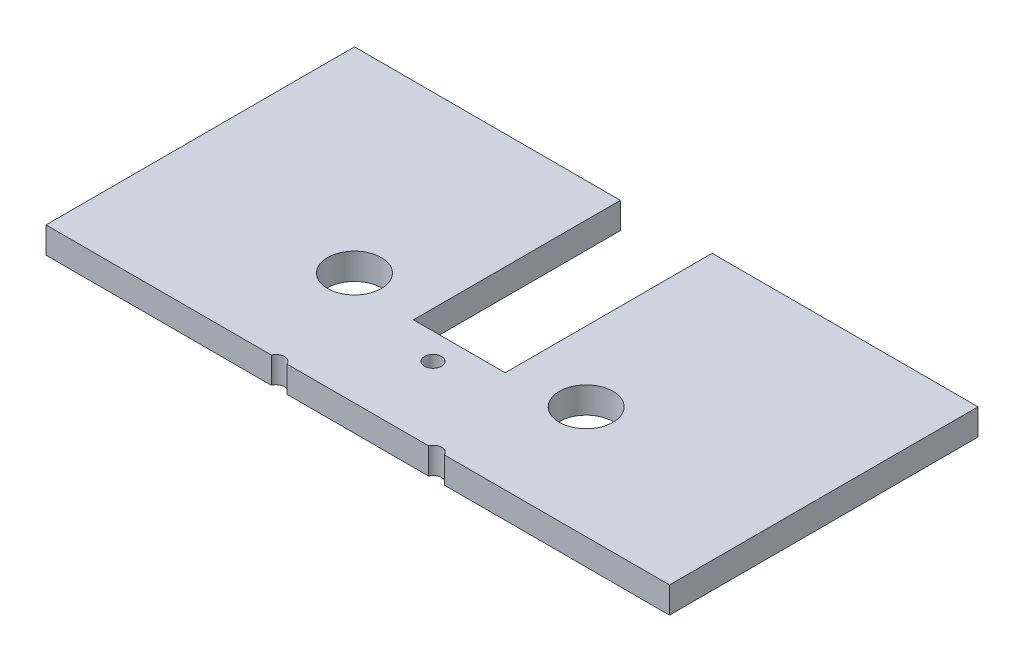
ISO-10303-21;
HEADER;
FILE_DESCRIPTION(('STEP AP214'),'2;1');
FILE_NAME('part.step','',(''),(''),'','','');
FILE_SCHEMA(('AUTOMOTIVE_DESIGN { 1 0 10303 214 1 1 1 1 }'));
ENDSEC;
DATA;
#1=APPLICATION_CONTEXT('core data for automotive mechanical design processes');
#2=APPLICATION_PROTOCOL_DEFINITION('international standard','automotive_design',2000,#1);
#3=PRODUCT_CONTEXT('',#1,'mechanical');
#4=PRODUCT('Part','Part','',(#3));
#5=PRODUCT_RELATED_PRODUCT_CATEGORY('part','',(#4));
#6=PRODUCT_DEFINITION_FORMATION('','',#4);
#7=PRODUCT_DEFINITION_CONTEXT('part definition',#1,'design');
#8=PRODUCT_DEFINITION('design','',#6,#7);
#9=PRODUCT_DEFINITION_SHAPE('','',#8);
#10=(LENGTH_UNIT() NAMED_UNIT(*) SI_UNIT(.MILLI.,.METRE.));
#11=(NAMED_UNIT(*) PLANE_ANGLE_UNIT() SI_UNIT($,.RADIAN.));
#12=(NAMED_UNIT(*) SI_UNIT($,.STERADIAN.) SOLID_ANGLE_UNIT());
#13=UNCERTAINTY_MEASURE_WITH_UNIT(LENGTH_MEASURE(1.E-05),#10,'distance_accuracy_value','');
#14=(GEOMETRIC_REPRESENTATION_CONTEXT(3) GLOBAL_UNCERTAINTY_ASSIGNED_CONTEXT((#13)) GLOBAL_UNIT_ASSIGNED_CONTEXT((#10,
#11,#12)) REPRESENTATION_CONTEXT('',''));
#15=CARTESIAN_POINT('',(0.,0.,0.));
#16=DIRECTION('',(0.,0.,1.));
#17=DIRECTION('',(1.,0.,0.));
#18=AXIS2_PLACEMENT_3D('',#15,#16,#17);
#19=CARTESIAN_POINT('',(-13.78858,2.,6.76929));
#20=DIRECTION('',(0.,0.,-1.));
#21=DIRECTION('',(-1.,0.,0.));
#22=AXIS2_PLACEMENT_3D('',#19,#20,#21);
#23=PLANE('',#22);
#24=DIRECTION('',(1.,0.,0.));
#25=VECTOR('',#24,1.);
#26=CARTESIAN_POINT('',(-13.78858,0.,6.76929));
#27=LINE('',#26,#25);
#28=CARTESIAN_POINT('',(-5.4,0.,6.76929));
#29=VERTEX_POINT('',#28);
#30=CARTESIAN_POINT('',(5.4,0.,6.76929));
#31=VERTEX_POINT('',#30);
#32=EDGE_CURVE('E142',#29,#31,#27,.T.);
#33=ORIENTED_EDGE('',*,*,#32,.T.);
#34=DIRECTION('',(0.,1.,0.));
#35=VECTOR('',#34,1.);
#36=CARTESIAN_POINT('',(5.4,0.,6.76929));
#37=LINE('',#36,#35);
#38=CARTESIAN_POINT('',(5.4,2.,6.76929));
#39=VERTEX_POINT('',#38);
#40=EDGE_CURVE('E11',#31,#39,#37,.T.);
#41=ORIENTED_EDGE('',*,*,#40,.T.);
#42=DIRECTION('',(1.,0.,0.));
#43=VECTOR('',#42,1.);
#44=CARTESIAN_POINT('',(-13.78858,2.,6.76929));
#45=LINE('',#44,#43);
#46=CARTESIAN_POINT('',(-5.4,2.,6.76929));
#47=VERTEX_POINT('',#46);
#48=EDGE_CURVE('E253',#47,#39,#45,.T.);
#49=ORIENTED_EDGE('',*,*,#48,.F.);
#50=DIRECTION('',(0.,1.,0.));
#51=VECTOR('',#50,1.);
#52=CARTESIAN_POINT('',(-5.4,0.,6.76929));
#53=LINE('',#52,#51);
#54=EDGE_CURVE('E270',#47,#29,#53,.F.);
#55=ORIENTED_EDGE('',*,*,#54,.T.);
#56=EDGE_LOOP('',(#33,#41,#49,#55));
#57=FACE_BOUND('',#56,.T.);
#58=ADVANCED_FACE('F43',(#57),#23,.F.);
#59=CARTESIAN_POINT('',(-23.78858,0.,6.76929));
#60=VERTEX_POINT('',#59);
#61=CARTESIAN_POINT('',(-6.6,0.,6.76929));
#62=VERTEX_POINT('',#61);
#63=EDGE_CURVE('E145',#60,#62,#27,.T.);
#64=ORIENTED_EDGE('',*,*,#63,.T.);
#65=DIRECTION('',(0.,1.,0.));
#66=VECTOR('',#65,1.);
#67=CARTESIAN_POINT('',(-6.6,0.,6.76929));
#68=LINE('',#67,#66);
#69=CARTESIAN_POINT('',(-6.6,2.,6.76929));
#70=VERTEX_POINT('',#69);
#71=EDGE_CURVE('E273',#62,#70,#68,.T.);
#72=ORIENTED_EDGE('',*,*,#71,.T.);
#73=CARTESIAN_POINT('',(-23.78858,2.,6.76929));
#74=VERTEX_POINT('',#73);
#75=EDGE_CURVE('E248',#74,#70,#45,.T.);
#76=ORIENTED_EDGE('',*,*,#75,.F.);
#77=DIRECTION('',(0.,1.,0.));
#78=VECTOR('',#77,1.);
#79=CARTESIAN_POINT('',(-23.78858,-31.0755728319334,6.76929));
#80=LINE('',#79,#78);
#81=EDGE_CURVE('E183',#60,#74,#80,.T.);
#82=ORIENTED_EDGE('',*,*,#81,.F.);
#83=EDGE_LOOP('',(#64,#72,#76,#82));
#84=FACE_BOUND('',#83,.T.);
#85=ADVANCED_FACE('F288',(#84),#23,.F.);
#86=CARTESIAN_POINT('',(0.,2.,0.));
#87=DIRECTION('',(0.,1.,0.));
#88=DIRECTION('',(0.,0.,1.));
#89=AXIS2_PLACEMENT_3D('',#86,#87,#88);
#90=PLANE('',#89);
#91=DIRECTION('',(-1.,0.,0.));
#92=VECTOR('',#91,1.);
#93=CARTESIAN_POINT('',(3.5,2.,-16.76929));
#94=LINE('',#93,#92);
#95=CARTESIAN_POINT('',(23.78858,2.,-16.76929));
#96=VERTEX_POINT('',#95);
#97=CARTESIAN_POINT('',(3.5,2.,-16.76929));
#98=VERTEX_POINT('',#97);
#99=EDGE_CURVE('E161',#96,#98,#94,.T.);
#100=ORIENTED_EDGE('',*,*,#99,.T.);
#101=DIRECTION('',(0.,0.,1.));
#102=VECTOR('',#101,1.);
#103=CARTESIAN_POINT('',(3.5,2.,-0.980710000000001));
#104=LINE('',#103,#102);
#105=CARTESIAN_POINT('',(3.5,2.,-0.980710000000001));
#106=VERTEX_POINT('',#105);
#107=EDGE_CURVE('E238',#98,#106,#104,.T.);
#108=ORIENTED_EDGE('',*,*,#107,.T.);
#109=DIRECTION('',(-1.,0.,0.));
#110=VECTOR('',#109,1.);
#111=CARTESIAN_POINT('',(-3.5,2.,-0.98071));
#112=LINE('',#111,#110);
#113=CARTESIAN_POINT('',(-3.5,2.,-0.98071));
#114=VERTEX_POINT('',#113);
#115=EDGE_CURVE('E241',#106,#114,#112,.T.);
#116=ORIENTED_EDGE('',*,*,#115,.T.);
#117=DIRECTION('',(0.,0.,-1.));
#118=VECTOR('',#117,1.);
#119=CARTESIAN_POINT('',(-3.5,2.,-6.76929));
#120=LINE('',#119,#118);
#121=CARTESIAN_POINT('',(-3.5,2.,-16.76929));
#122=VERTEX_POINT('',#121);
#123=EDGE_CURVE('E244',#114,#122,#120,.T.);
#124=ORIENTED_EDGE('',*,*,#123,.T.);
#125=DIRECTION('',(-1.,0.,0.));
#126=VECTOR('',#125,1.);
#127=CARTESIAN_POINT('',(-23.78858,2.,-16.76929));
#128=LINE('',#127,#126);
#129=CARTESIAN_POINT('',(-23.78858,2.,-16.76929));
#130=VERTEX_POINT('',#129);
#131=EDGE_CURVE('E175',#122,#130,#128,.T.);
#132=ORIENTED_EDGE('',*,*,#131,.T.);
#133=DIRECTION('',(0.,0.,1.));
#134=VECTOR('',#133,1.);
#135=CARTESIAN_POINT('',(-23.78858,2.,6.76929));
#136=LINE('',#135,#134);
#137=EDGE_CURVE('E189',#130,#74,#136,.T.);
#138=ORIENTED_EDGE('',*,*,#137,.T.);
#139=ORIENTED_EDGE('',*,*,#75,.T.);
#140=CARTESIAN_POINT('',(-6.,2.,7.01929));
#141=DIRECTION('',(0.,1.,0.));
#142=DIRECTION('',(0.,0.,1.));
#143=AXIS2_PLACEMENT_3D('',#140,#141,#142);
#144=CIRCLE('',#143,0.65);
#145=EDGE_CURVE('E209',#47,#70,#144,.T.);
#146=ORIENTED_EDGE('',*,*,#145,.F.);
#147=ORIENTED_EDGE('',*,*,#48,.T.);
#148=CARTESIAN_POINT('',(6.,2.,7.01929));
#149=DIRECTION('',(0.,1.,0.));
#150=DIRECTION('',(0.,0.,1.));
#151=AXIS2_PLACEMENT_3D('',#148,#149,#150);
#152=CIRCLE('',#151,0.65);
#153=CARTESIAN_POINT('',(6.6,2.,6.76929));
#154=VERTEX_POINT('',#153);
#155=EDGE_CURVE('E206',#154,#39,#152,.T.);
#156=ORIENTED_EDGE('',*,*,#155,.F.);
#157=CARTESIAN_POINT('',(23.78858,2.,6.76929));
#158=VERTEX_POINT('',#157);
#159=EDGE_CURVE('E247',#154,#158,#45,.T.);
#160=ORIENTED_EDGE('',*,*,#159,.T.);
#161=DIRECTION('',(0.,0.,-1.));
#162=VECTOR('',#161,1.);
#163=CARTESIAN_POINT('',(23.78858,2.,-16.76929));
#164=LINE('',#163,#162);
#165=EDGE_CURVE('E159',#158,#96,#164,.T.);
#166=ORIENTED_EDGE('',*,*,#165,.T.);
#167=EDGE_LOOP('',(#100,#108,#116,#124,#132,#138,#139,#146,#147,#156,#160,#166));
#168=FACE_BOUND('',#167,.T.);
#169=CARTESIAN_POINT('',(-0.00858000000000282,2.,1.01929));
#170=DIRECTION('',(0.,1.,0.));
#171=DIRECTION('',(0.,0.,1.));
#172=AXIS2_PLACEMENT_3D('',#169,#170,#171);
#173=CIRCLE('',#172,0.65);
#174=CARTESIAN_POINT('',(-0.00858000000000282,2.,1.66929));
#175=VERTEX_POINT('',#174);
#176=EDGE_CURVE('E205',#175,#175,#173,.T.);
#177=ORIENTED_EDGE('',*,*,#176,.F.);
#178=EDGE_LOOP('',(#177));
#179=FACE_BOUND('',#178,.T.);
#180=CARTESIAN_POINT('',(-8.84,2.,-1.81955));
#181=DIRECTION('',(0.,1.,0.));
#182=DIRECTION('',(0.,0.,1.));
#183=AXIS2_PLACEMENT_3D('',#180,#181,#182);
#184=CIRCLE('',#183,2.05);
#185=CARTESIAN_POINT('',(-8.84,2.,0.23045));
#186=VERTEX_POINT('',#185);
#187=EDGE_CURVE('E230',#186,#186,#184,.T.);
#188=ORIENTED_EDGE('',*,*,#187,.F.);
#189=EDGE_LOOP('',(#188));
#190=FACE_BOUND('',#189,.T.);
#191=CARTESIAN_POINT('',(8.84,2.,-1.81955));
#192=DIRECTION('',(0.,1.,0.));
#193=DIRECTION('',(0.,0.,1.));
#194=AXIS2_PLACEMENT_3D('',#191,#192,#193);
#195=CIRCLE('',#194,2.05);
#196=CARTESIAN_POINT('',(8.84,2.,0.23045));
#197=VERTEX_POINT('',#196);
#198=EDGE_CURVE('E222',#197,#197,#195,.T.);
#199=ORIENTED_EDGE('',*,*,#198,.F.);
#200=EDGE_LOOP('',(#199));
#201=FACE_BOUND('',#200,.T.);
#202=ADVANCED_FACE('F294',(#168,#179,#190,#201),#90,.T.);
#203=CARTESIAN_POINT('',(0.,0.,0.));
#204=DIRECTION('',(0.,1.,0.));
#205=DIRECTION('',(0.,0.,1.));
#206=AXIS2_PLACEMENT_3D('',#203,#204,#205);
#207=PLANE('',#206);
#208=DIRECTION('',(0.,0.,1.));
#209=VECTOR('',#208,1.);
#210=CARTESIAN_POINT('',(3.5,0.,-0.980710000000001));
#211=LINE('',#210,#209);
#212=CARTESIAN_POINT('',(3.5,0.,-16.76929));
#213=VERTEX_POINT('',#212);
#214=CARTESIAN_POINT('',(3.5,0.,-0.980710000000001));
#215=VERTEX_POINT('',#214);
#216=EDGE_CURVE('E234',#213,#215,#211,.T.);
#217=ORIENTED_EDGE('',*,*,#216,.F.);
#218=DIRECTION('',(1.,0.,0.));
#219=VECTOR('',#218,1.);
#220=CARTESIAN_POINT('',(3.5,0.,-16.76929));
#221=LINE('',#220,#219);
#222=CARTESIAN_POINT('',(23.78858,0.,-16.76929));
#223=VERTEX_POINT('',#222);
#224=EDGE_CURVE('E151',#213,#223,#221,.T.);
#225=ORIENTED_EDGE('',*,*,#224,.T.);
#226=DIRECTION('',(0.,0.,1.));
#227=VECTOR('',#226,1.);
#228=CARTESIAN_POINT('',(23.78858,0.,-16.76929));
#229=LINE('',#228,#227);
#230=CARTESIAN_POINT('',(23.78858,0.,6.76929));
#231=VERTEX_POINT('',#230);
#232=EDGE_CURVE('E147',#223,#231,#229,.T.);
#233=ORIENTED_EDGE('',*,*,#232,.T.);
#234=CARTESIAN_POINT('',(6.6,0.,6.76929));
#235=VERTEX_POINT('',#234);
#236=EDGE_CURVE('E133',#235,#231,#27,.T.);
#237=ORIENTED_EDGE('',*,*,#236,.F.);
#238=CARTESIAN_POINT('',(6.,0.,7.01929));
#239=DIRECTION('',(0.,1.,0.));
#240=DIRECTION('',(0.,0.,1.));
#241=AXIS2_PLACEMENT_3D('',#238,#239,#240);
#242=CIRCLE('',#241,0.65);
#243=EDGE_CURVE('E59',#235,#31,#242,.T.);
#244=ORIENTED_EDGE('',*,*,#243,.T.);
#245=ORIENTED_EDGE('',*,*,#32,.F.);
#246=CARTESIAN_POINT('',(-6.,0.,7.01929));
#247=DIRECTION('',(0.,1.,0.));
#248=DIRECTION('',(0.,0.,1.));
#249=AXIS2_PLACEMENT_3D('',#246,#247,#248);
#250=CIRCLE('',#249,0.65);
#251=EDGE_CURVE('E67',#29,#62,#250,.T.);
#252=ORIENTED_EDGE('',*,*,#251,.T.);
#253=ORIENTED_EDGE('',*,*,#63,.F.);
#254=DIRECTION('',(0.,0.,-1.));
#255=VECTOR('',#254,1.);
#256=CARTESIAN_POINT('',(-23.78858,0.,6.76929));
#257=LINE('',#256,#255);
#258=CARTESIAN_POINT('',(-23.78858,0.,-16.76929));
#259=VERTEX_POINT('',#258);
#260=EDGE_CURVE('E182',#60,#259,#257,.T.);
#261=ORIENTED_EDGE('',*,*,#260,.T.);
#262=DIRECTION('',(1.,0.,0.));
#263=VECTOR('',#262,1.);
#264=CARTESIAN_POINT('',(-23.78858,0.,-16.76929));
#265=LINE('',#264,#263);
#266=CARTESIAN_POINT('',(-3.5,0.,-16.76929));
#267=VERTEX_POINT('',#266);
#268=EDGE_CURVE('E178',#259,#267,#265,.T.);
#269=ORIENTED_EDGE('',*,*,#268,.T.);
#270=DIRECTION('',(0.,0.,-1.));
#271=VECTOR('',#270,1.);
#272=CARTESIAN_POINT('',(-3.5,0.,-6.76929));
#273=LINE('',#272,#271);
#274=CARTESIAN_POINT('',(-3.5,0.,-0.98071));
#275=VERTEX_POINT('',#274);
#276=EDGE_CURVE('E143',#275,#267,#273,.T.);
#277=ORIENTED_EDGE('',*,*,#276,.F.);
#278=DIRECTION('',(-1.,0.,0.));
#279=VECTOR('',#278,1.);
#280=CARTESIAN_POINT('',(-3.5,0.,-0.98071));
#281=LINE('',#280,#279);
#282=EDGE_CURVE('E256',#215,#275,#281,.T.);
#283=ORIENTED_EDGE('',*,*,#282,.F.);
#284=EDGE_LOOP('',(#217,#225,#233,#237,#244,#245,#252,#253,#261,#269,#277,#283));
#285=FACE_BOUND('',#284,.T.);
#286=CARTESIAN_POINT('',(-0.00858000000000282,0.,1.01929));
#287=DIRECTION('',(0.,1.,0.));
#288=DIRECTION('',(0.,0.,1.));
#289=AXIS2_PLACEMENT_3D('',#286,#287,#288);
#290=CIRCLE('',#289,0.65);
#291=CARTESIAN_POINT('',(-0.00858000000000282,0.,1.66929));
#292=VERTEX_POINT('',#291);
#293=EDGE_CURVE('E214',#292,#292,#290,.T.);
#294=ORIENTED_EDGE('',*,*,#293,.T.);
#295=EDGE_LOOP('',(#294));
#296=FACE_BOUND('',#295,.T.);
#297=CARTESIAN_POINT('',(-8.84,0.,-1.81955));
#298=DIRECTION('',(0.,1.,0.));
#299=DIRECTION('',(0.,0.,1.));
#300=AXIS2_PLACEMENT_3D('',#297,#298,#299);
#301=CIRCLE('',#300,2.05);
#302=CARTESIAN_POINT('',(-8.84,0.,0.23045));
#303=VERTEX_POINT('',#302);
#304=EDGE_CURVE('E226',#303,#303,#301,.T.);
#305=ORIENTED_EDGE('',*,*,#304,.T.);
#306=EDGE_LOOP('',(#305));
#307=FACE_BOUND('',#306,.T.);
#308=CARTESIAN_POINT('',(8.84,0.,-1.81955));
#309=DIRECTION('',(0.,1.,0.));
#310=DIRECTION('',(0.,0.,1.));
#311=AXIS2_PLACEMENT_3D('',#308,#309,#310);
#312=CIRCLE('',#311,2.05);
#313=CARTESIAN_POINT('',(8.84,0.,0.23045));
#314=VERTEX_POINT('',#313);
#315=EDGE_CURVE('E218',#314,#314,#312,.T.);
#316=ORIENTED_EDGE('',*,*,#315,.T.);
#317=EDGE_LOOP('',(#316));
#318=FACE_BOUND('',#317,.T.);
#319=ADVANCED_FACE('F148',(#285,#296,#307,#318),#207,.F.);
#320=CARTESIAN_POINT('',(3.5,2.,-0.980710000000001));
#321=DIRECTION('',(1.,0.,0.));
#322=DIRECTION('',(0.,0.,-1.));
#323=AXIS2_PLACEMENT_3D('',#320,#321,#322);
#324=PLANE('',#323);
#325=ORIENTED_EDGE('',*,*,#216,.T.);
#326=DIRECTION('',(0.,-1.,0.));
#327=VECTOR('',#326,1.);
#328=CARTESIAN_POINT('',(3.5,2.,-0.980710000000001));
#329=LINE('',#328,#327);
#330=EDGE_CURVE('E266',#106,#215,#329,.T.);
#331=ORIENTED_EDGE('',*,*,#330,.F.);
#332=ORIENTED_EDGE('',*,*,#107,.F.);
#333=DIRECTION('',(0.,1.,0.));
#334=VECTOR('',#333,1.);
#335=CARTESIAN_POINT('',(3.5,-31.0755728319334,-16.76929));
#336=LINE('',#335,#334);
#337=EDGE_CURVE('E155',#213,#98,#336,.T.);
#338=ORIENTED_EDGE('',*,*,#337,.F.);
#339=EDGE_LOOP('',(#325,#331,#332,#338));
#340=FACE_BOUND('',#339,.T.);
#341=ADVANCED_FACE('F45',(#340),#324,.F.);
#342=CARTESIAN_POINT('',(-3.5,2.,-0.98071));
#343=DIRECTION('',(0.,0.,1.));
#344=DIRECTION('',(1.,0.,0.));
#345=AXIS2_PLACEMENT_3D('',#342,#343,#344);
#346=PLANE('',#345);
#347=ORIENTED_EDGE('',*,*,#282,.T.);
#348=DIRECTION('',(0.,-1.,0.));
#349=VECTOR('',#348,1.);
#350=CARTESIAN_POINT('',(-3.5,2.,-0.98071));
#351=LINE('',#350,#349);
#352=EDGE_CURVE('E252',#114,#275,#351,.T.);
#353=ORIENTED_EDGE('',*,*,#352,.F.);
#354=ORIENTED_EDGE('',*,*,#115,.F.);
#355=ORIENTED_EDGE('',*,*,#330,.T.);
#356=EDGE_LOOP('',(#347,#353,#354,#355));
#357=FACE_BOUND('',#356,.T.);
#358=ADVANCED_FACE('F310',(#357),#346,.F.);
#359=CARTESIAN_POINT('',(-3.5,2.,-6.76929));
#360=DIRECTION('',(-1.,0.,0.));
#361=DIRECTION('',(0.,0.,1.));
#362=AXIS2_PLACEMENT_3D('',#359,#360,#361);
#363=PLANE('',#362);
#364=ORIENTED_EDGE('',*,*,#276,.T.);
#365=DIRECTION('',(0.,1.,0.));
#366=VECTOR('',#365,1.);
#367=CARTESIAN_POINT('',(-3.5,-31.0755728319334,-16.76929));
#368=LINE('',#367,#366);
#369=EDGE_CURVE('E193',#267,#122,#368,.T.);
#370=ORIENTED_EDGE('',*,*,#369,.T.);
#371=ORIENTED_EDGE('',*,*,#123,.F.);
#372=ORIENTED_EDGE('',*,*,#352,.T.);
#373=EDGE_LOOP('',(#364,#370,#371,#372));
#374=FACE_BOUND('',#373,.T.);
#375=ADVANCED_FACE('F306',(#374),#363,.F.);
#376=ORIENTED_EDGE('',*,*,#159,.F.);
#377=DIRECTION('',(0.,1.,0.));
#378=VECTOR('',#377,1.);
#379=CARTESIAN_POINT('',(6.6,0.,6.76929));
#380=LINE('',#379,#378);
#381=EDGE_CURVE('E52',#154,#235,#380,.F.);
#382=ORIENTED_EDGE('',*,*,#381,.T.);
#383=ORIENTED_EDGE('',*,*,#236,.T.);
#384=DIRECTION('',(0.,1.,0.));
#385=VECTOR('',#384,1.);
#386=CARTESIAN_POINT('',(23.78858,-31.0755728319334,6.76929));
#387=LINE('',#386,#385);
#388=EDGE_CURVE('E138',#231,#158,#387,.T.);
#389=ORIENTED_EDGE('',*,*,#388,.T.);
#390=EDGE_LOOP('',(#376,#382,#383,#389));
#391=FACE_BOUND('',#390,.T.);
#392=ADVANCED_FACE('F136',(#391),#23,.F.);
#393=CARTESIAN_POINT('',(-8.84,2.,-1.81955));
#394=DIRECTION('',(0.,-1.,0.));
#395=DIRECTION('',(0.,0.,-1.));
#396=AXIS2_PLACEMENT_3D('',#393,#394,#395);
#397=CYLINDRICAL_SURFACE('',#396,2.05);
#398=ORIENTED_EDGE('',*,*,#187,.T.);
#399=EDGE_LOOP('',(#398));
#400=FACE_BOUND('',#399,.T.);
#401=ORIENTED_EDGE('',*,*,#304,.F.);
#402=EDGE_LOOP('',(#401));
#403=FACE_BOUND('',#402,.T.);
#404=ADVANCED_FACE('F339',(#400,#403),#397,.F.);
#405=CARTESIAN_POINT('',(8.84,2.,-1.81955));
#406=DIRECTION('',(0.,-1.,0.));
#407=DIRECTION('',(0.,0.,-1.));
#408=AXIS2_PLACEMENT_3D('',#405,#406,#407);
#409=CYLINDRICAL_SURFACE('',#408,2.05);
#410=ORIENTED_EDGE('',*,*,#198,.T.);
#411=EDGE_LOOP('',(#410));
#412=FACE_BOUND('',#411,.T.);
#413=ORIENTED_EDGE('',*,*,#315,.F.);
#414=EDGE_LOOP('',(#413));
#415=FACE_BOUND('',#414,.T.);
#416=ADVANCED_FACE('F344',(#412,#415),#409,.F.);
#417=CARTESIAN_POINT('',(-0.00858000000000282,0.,1.01929));
#418=DIRECTION('',(0.,1.,0.));
#419=DIRECTION('',(0.,0.,1.));
#420=AXIS2_PLACEMENT_3D('',#417,#418,#419);
#421=CYLINDRICAL_SURFACE('',#420,0.65);
#422=ORIENTED_EDGE('',*,*,#293,.F.);
#423=EDGE_LOOP('',(#422));
#424=FACE_BOUND('',#423,.T.);
#425=ORIENTED_EDGE('',*,*,#176,.T.);
#426=EDGE_LOOP('',(#425));
#427=FACE_BOUND('',#426,.T.);
#428=ADVANCED_FACE('F328',(#424,#427),#421,.F.);
#429=CARTESIAN_POINT('',(-6.,0.,7.01929));
#430=DIRECTION('',(0.,1.,0.));
#431=DIRECTION('',(0.,0.,1.));
#432=AXIS2_PLACEMENT_3D('',#429,#430,#431);
#433=CYLINDRICAL_SURFACE('',#432,0.65);
#434=ORIENTED_EDGE('',*,*,#251,.F.);
#435=ORIENTED_EDGE('',*,*,#54,.F.);
#436=ORIENTED_EDGE('',*,*,#145,.T.);
#437=ORIENTED_EDGE('',*,*,#71,.F.);
#438=EDGE_LOOP('',(#434,#435,#436,#437));
#439=FACE_BOUND('',#438,.T.);
#440=ADVANCED_FACE('F320',(#439),#433,.F.);
#441=CARTESIAN_POINT('',(6.,0.,7.01929));
#442=DIRECTION('',(0.,1.,0.));
#443=DIRECTION('',(0.,0.,1.));
#444=AXIS2_PLACEMENT_3D('',#441,#442,#443);
#445=CYLINDRICAL_SURFACE('',#444,0.65);
#446=ORIENTED_EDGE('',*,*,#243,.F.);
#447=ORIENTED_EDGE('',*,*,#381,.F.);
#448=ORIENTED_EDGE('',*,*,#155,.T.);
#449=ORIENTED_EDGE('',*,*,#40,.F.);
#450=EDGE_LOOP('',(#446,#447,#448,#449));
#451=FACE_BOUND('',#450,.T.);
#452=ADVANCED_FACE('F318',(#451),#445,.F.);
#453=CARTESIAN_POINT('',(-23.78858,-31.0755728319334,6.76929));
#454=DIRECTION('',(-1.,0.,0.));
#455=DIRECTION('',(0.,0.,1.));
#456=AXIS2_PLACEMENT_3D('',#453,#454,#455);
#457=PLANE('',#456);
#458=ORIENTED_EDGE('',*,*,#260,.F.);
#459=ORIENTED_EDGE('',*,*,#81,.T.);
#460=ORIENTED_EDGE('',*,*,#137,.F.);
#461=DIRECTION('',(0.,1.,0.));
#462=VECTOR('',#461,1.);
#463=CARTESIAN_POINT('',(-23.78858,-31.0755728319334,-16.76929));
#464=LINE('',#463,#462);
#465=EDGE_CURVE('E197',#259,#130,#464,.T.);
#466=ORIENTED_EDGE('',*,*,#465,.F.);
#467=EDGE_LOOP('',(#458,#459,#460,#466));
#468=FACE_BOUND('',#467,.T.);
#469=ADVANCED_FACE('F291',(#468),#457,.T.);
#470=CARTESIAN_POINT('',(-23.78858,-31.0755728319334,-16.76929));
#471=DIRECTION('',(0.,0.,-1.));
#472=DIRECTION('',(-1.,0.,0.));
#473=AXIS2_PLACEMENT_3D('',#470,#471,#472);
#474=PLANE('',#473);
#475=ORIENTED_EDGE('',*,*,#268,.F.);
#476=ORIENTED_EDGE('',*,*,#465,.T.);
#477=ORIENTED_EDGE('',*,*,#131,.F.);
#478=ORIENTED_EDGE('',*,*,#369,.F.);
#479=EDGE_LOOP('',(#475,#476,#477,#478));
#480=FACE_BOUND('',#479,.T.);
#481=ADVANCED_FACE('F302',(#480),#474,.T.);
#482=CARTESIAN_POINT('',(3.5,-31.0755728319334,-16.76929));
#483=DIRECTION('',(0.,0.,-1.));
#484=DIRECTION('',(-1.,0.,0.));
#485=AXIS2_PLACEMENT_3D('',#482,#483,#484);
#486=PLANE('',#485);
#487=ORIENTED_EDGE('',*,*,#224,.F.);
#488=ORIENTED_EDGE('',*,*,#337,.T.);
#489=ORIENTED_EDGE('',*,*,#99,.F.);
#490=DIRECTION('',(0.,1.,0.));
#491=VECTOR('',#490,1.);
#492=CARTESIAN_POINT('',(23.78858,-31.0755728319334,-16.76929));
#493=LINE('',#492,#491);
#494=EDGE_CURVE('E162',#223,#96,#493,.T.);
#495=ORIENTED_EDGE('',*,*,#494,.F.);
#496=EDGE_LOOP('',(#487,#488,#489,#495));
#497=FACE_BOUND('',#496,.T.);
#498=ADVANCED_FACE('F315',(#497),#486,.T.);
#499=CARTESIAN_POINT('',(23.78858,-31.0755728319334,-16.76929));
#500=DIRECTION('',(1.,0.,0.));
#501=DIRECTION('',(0.,0.,-1.));
#502=AXIS2_PLACEMENT_3D('',#499,#500,#501);
#503=PLANE('',#502);
#504=ORIENTED_EDGE('',*,*,#232,.F.);
#505=ORIENTED_EDGE('',*,*,#494,.T.);
#506=ORIENTED_EDGE('',*,*,#165,.F.);
#507=ORIENTED_EDGE('',*,*,#388,.F.);
#508=EDGE_LOOP('',(#504,#505,#506,#507));
#509=FACE_BOUND('',#508,.T.);
#510=ADVANCED_FACE('F157',(#509),#503,.T.);
#511=CLOSED_SHELL('',(#58,#85,#202,#319,#341,#358,#375,#392,#404,#416,#428,#440,#452,#469,#481,
#498,#510));
#512=MANIFOLD_SOLID_BREP('B2',#511);
#513=ADVANCED_BREP_SHAPE_REPRESENTATION('',(#18,#512),#14);
#514=SHAPE_DEFINITION_REPRESENTATION(#9,#513);
ENDSEC;
END-ISO-10303-21;
